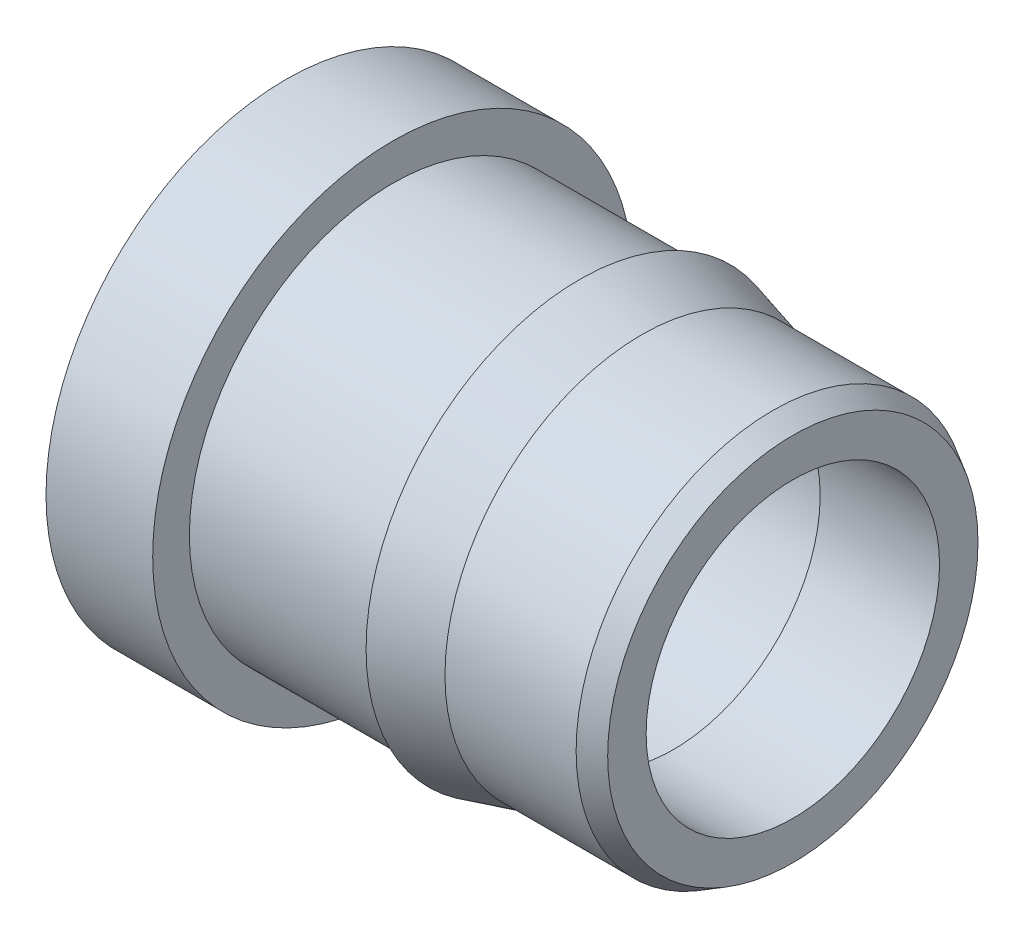
ISO-10303-21;
HEADER;
FILE_DESCRIPTION(('STEP AP214'),'2;1');
FILE_NAME('part.step','',(''),(''),'','','');
FILE_SCHEMA(('AUTOMOTIVE_DESIGN { 1 0 10303 214 1 1 1 1 }'));
ENDSEC;
DATA;
#1=APPLICATION_CONTEXT('core data for automotive mechanical design processes');
#2=APPLICATION_PROTOCOL_DEFINITION('international standard','automotive_design',2000,#1);
#3=PRODUCT_CONTEXT('',#1,'mechanical');
#4=PRODUCT('Part','Part','',(#3));
#5=PRODUCT_RELATED_PRODUCT_CATEGORY('part','',(#4));
#6=PRODUCT_DEFINITION_FORMATION('','',#4);
#7=PRODUCT_DEFINITION_CONTEXT('part definition',#1,'design');
#8=PRODUCT_DEFINITION('design','',#6,#7);
#9=PRODUCT_DEFINITION_SHAPE('','',#8);
#10=(LENGTH_UNIT() NAMED_UNIT(*) SI_UNIT(.MILLI.,.METRE.));
#11=(NAMED_UNIT(*) PLANE_ANGLE_UNIT() SI_UNIT($,.RADIAN.));
#12=(NAMED_UNIT(*) SI_UNIT($,.STERADIAN.) SOLID_ANGLE_UNIT());
#13=UNCERTAINTY_MEASURE_WITH_UNIT(LENGTH_MEASURE(1.E-05),#10,'distance_accuracy_value','');
#14=(GEOMETRIC_REPRESENTATION_CONTEXT(3) GLOBAL_UNCERTAINTY_ASSIGNED_CONTEXT((#13)) GLOBAL_UNIT_ASSIGNED_CONTEXT((#10,
#11,#12)) REPRESENTATION_CONTEXT('',''));
#15=CARTESIAN_POINT('',(0.,0.,0.));
#16=DIRECTION('',(0.,0.,1.));
#17=DIRECTION('',(1.,0.,0.));
#18=AXIS2_PLACEMENT_3D('',#15,#16,#17);
#19=CARTESIAN_POINT('',(1.9304,0.705305909487722,0.));
#20=DIRECTION('',(-1.,0.,0.));
#21=DIRECTION('',(0.,0.,1.));
#22=AXIS2_PLACEMENT_3D('',#19,#20,#21);
#23=PLANE('',#22);
#24=CARTESIAN_POINT('',(1.9304,0.,0.));
#25=DIRECTION('',(1.,0.,0.));
#26=DIRECTION('',(0.,0.,-1.));
#27=AXIS2_PLACEMENT_3D('',#24,#25,#26);
#28=CIRCLE('',#27,0.5588);
#29=CARTESIAN_POINT('',(1.9304,0.,-0.5588));
#30=VERTEX_POINT('',#29);
#31=EDGE_CURVE('E68',#30,#30,#28,.T.);
#32=ORIENTED_EDGE('',*,*,#31,.F.);
#33=EDGE_LOOP('',(#32));
#34=FACE_BOUND('',#33,.T.);
#35=CARTESIAN_POINT('',(1.9304,0.,0.));
#36=DIRECTION('',(-1.,0.,0.));
#37=DIRECTION('',(0.,0.,1.));
#38=AXIS2_PLACEMENT_3D('',#35,#36,#37);
#39=CIRCLE('',#38,0.705305909487722);
#40=CARTESIAN_POINT('',(1.9304,0.,0.705305909487722));
#41=VERTEX_POINT('',#40);
#42=EDGE_CURVE('E10',#41,#41,#39,.T.);
#43=ORIENTED_EDGE('',*,*,#42,.F.);
#44=EDGE_LOOP('',(#43));
#45=FACE_BOUND('',#44,.T.);
#46=ADVANCED_FACE('F31',(#34,#45),#23,.F.);
#47=CARTESIAN_POINT('',(1.9304,0.,0.));
#48=DIRECTION('',(-1.,0.,0.));
#49=DIRECTION('',(0.,0.,1.));
#50=AXIS2_PLACEMENT_3D('',#47,#48,#49);
#51=CONICAL_SURFACE('',#50,0.705305909487722,0.523598775598397);
#52=CARTESIAN_POINT('',(1.8542,0.,0.));
#53=DIRECTION('',(-1.,0.,0.));
#54=DIRECTION('',(0.,0.,1.));
#55=AXIS2_PLACEMENT_3D('',#52,#53,#54);
#56=CIRCLE('',#55,0.749299999999981);
#57=CARTESIAN_POINT('',(1.8542,0.,0.749299999999981));
#58=VERTEX_POINT('',#57);
#59=EDGE_CURVE('E38',#58,#58,#56,.T.);
#60=ORIENTED_EDGE('',*,*,#59,.F.);
#61=EDGE_LOOP('',(#60));
#62=FACE_BOUND('',#61,.T.);
#63=ORIENTED_EDGE('',*,*,#42,.T.);
#64=EDGE_LOOP('',(#63));
#65=FACE_BOUND('',#64,.T.);
#66=ADVANCED_FACE('F87',(#62,#65),#51,.T.);
#67=CARTESIAN_POINT('',(0.,0.,0.));
#68=DIRECTION('',(-1.,0.,0.));
#69=DIRECTION('',(0.,0.,1.));
#70=AXIS2_PLACEMENT_3D('',#67,#68,#69);
#71=CYLINDRICAL_SURFACE('',#70,0.749299999999981);
#72=CARTESIAN_POINT('',(1.35458522628059,0.,0.));
#73=DIRECTION('',(-1.,0.,0.));
#74=DIRECTION('',(0.,0.,1.));
#75=AXIS2_PLACEMENT_3D('',#72,#73,#74);
#76=CIRCLE('',#75,0.749299999999981);
#77=CARTESIAN_POINT('',(1.35458522628059,0.,0.749299999999981));
#78=VERTEX_POINT('',#77);
#79=EDGE_CURVE('E42',#78,#78,#76,.T.);
#80=ORIENTED_EDGE('',*,*,#79,.F.);
#81=EDGE_LOOP('',(#80));
#82=FACE_BOUND('',#81,.T.);
#83=ORIENTED_EDGE('',*,*,#59,.T.);
#84=EDGE_LOOP('',(#83));
#85=FACE_BOUND('',#84,.T.);
#86=ADVANCED_FACE('F92',(#82,#85),#71,.T.);
#87=CARTESIAN_POINT('',(1.35458522628059,0.,0.));
#88=DIRECTION('',(-1.,0.,0.));
#89=DIRECTION('',(0.,0.,1.));
#90=AXIS2_PLACEMENT_3D('',#87,#88,#89);
#91=CONICAL_SURFACE('',#90,0.749299999999981,0.261799387799376);
#92=CARTESIAN_POINT('',(1.1176,0.,0.));
#93=DIRECTION('',(-1.,0.,0.));
#94=DIRECTION('',(0.,0.,1.));
#95=AXIS2_PLACEMENT_3D('',#92,#93,#94);
#96=CIRCLE('',#95,0.81280000000003);
#97=CARTESIAN_POINT('',(1.1176,0.,0.81280000000003));
#98=VERTEX_POINT('',#97);
#99=EDGE_CURVE('E47',#98,#98,#96,.T.);
#100=ORIENTED_EDGE('',*,*,#99,.F.);
#101=EDGE_LOOP('',(#100));
#102=FACE_BOUND('',#101,.T.);
#103=ORIENTED_EDGE('',*,*,#79,.T.);
#104=EDGE_LOOP('',(#103));
#105=FACE_BOUND('',#104,.T.);
#106=ADVANCED_FACE('F98',(#102,#105),#91,.T.);
#107=CARTESIAN_POINT('',(1.1176,0.774699999999989,0.));
#108=DIRECTION('',(1.,0.,0.));
#109=DIRECTION('',(0.,0.,-1.));
#110=AXIS2_PLACEMENT_3D('',#107,#108,#109);
#111=PLANE('',#110);
#112=CARTESIAN_POINT('',(1.1176,0.,0.));
#113=DIRECTION('',(-1.,0.,0.));
#114=DIRECTION('',(0.,0.,1.));
#115=AXIS2_PLACEMENT_3D('',#112,#113,#114);
#116=CIRCLE('',#115,0.774699999999989);
#117=CARTESIAN_POINT('',(1.1176,0.,0.774699999999989));
#118=VERTEX_POINT('',#117);
#119=EDGE_CURVE('E50',#118,#118,#116,.T.);
#120=ORIENTED_EDGE('',*,*,#119,.F.);
#121=EDGE_LOOP('',(#120));
#122=FACE_BOUND('',#121,.T.);
#123=ORIENTED_EDGE('',*,*,#99,.T.);
#124=EDGE_LOOP('',(#123));
#125=FACE_BOUND('',#124,.T.);
#126=ADVANCED_FACE('F105',(#122,#125),#111,.F.);
#127=CARTESIAN_POINT('',(0.,0.,0.));
#128=DIRECTION('',(-1.,0.,0.));
#129=DIRECTION('',(0.,0.,1.));
#130=AXIS2_PLACEMENT_3D('',#127,#128,#129);
#131=CYLINDRICAL_SURFACE('',#130,0.774699999999989);
#132=CARTESIAN_POINT('',(0.406400000000001,0.,0.));
#133=DIRECTION('',(-1.,0.,0.));
#134=DIRECTION('',(0.,0.,1.));
#135=AXIS2_PLACEMENT_3D('',#132,#133,#134);
#136=CIRCLE('',#135,0.774699999999989);
#137=CARTESIAN_POINT('',(0.406400000000001,0.,0.774699999999989));
#138=VERTEX_POINT('',#137);
#139=EDGE_CURVE('E53',#138,#138,#136,.T.);
#140=ORIENTED_EDGE('',*,*,#139,.F.);
#141=EDGE_LOOP('',(#140));
#142=FACE_BOUND('',#141,.T.);
#143=ORIENTED_EDGE('',*,*,#119,.T.);
#144=EDGE_LOOP('',(#143));
#145=FACE_BOUND('',#144,.T.);
#146=ADVANCED_FACE('F109',(#142,#145),#131,.T.);
#147=CARTESIAN_POINT('',(0.406400000000001,0.914399999999982,0.));
#148=DIRECTION('',(-1.,0.,0.));
#149=DIRECTION('',(0.,0.,1.));
#150=AXIS2_PLACEMENT_3D('',#147,#148,#149);
#151=PLANE('',#150);
#152=CARTESIAN_POINT('',(0.406400000000001,0.,0.));
#153=DIRECTION('',(-1.,0.,0.));
#154=DIRECTION('',(0.,0.,1.));
#155=AXIS2_PLACEMENT_3D('',#152,#153,#154);
#156=CIRCLE('',#155,0.914399999999982);
#157=CARTESIAN_POINT('',(0.406400000000001,0.,0.914399999999982));
#158=VERTEX_POINT('',#157);
#159=EDGE_CURVE('E56',#158,#158,#156,.T.);
#160=ORIENTED_EDGE('',*,*,#159,.F.);
#161=EDGE_LOOP('',(#160));
#162=FACE_BOUND('',#161,.T.);
#163=ORIENTED_EDGE('',*,*,#139,.T.);
#164=EDGE_LOOP('',(#163));
#165=FACE_BOUND('',#164,.T.);
#166=ADVANCED_FACE('F113',(#162,#165),#151,.F.);
#167=CARTESIAN_POINT('',(0.,0.,0.));
#168=DIRECTION('',(-1.,0.,0.));
#169=DIRECTION('',(0.,0.,1.));
#170=AXIS2_PLACEMENT_3D('',#167,#168,#169);
#171=CYLINDRICAL_SURFACE('',#170,0.914399999999982);
#172=CARTESIAN_POINT('',(0.,0.,0.));
#173=DIRECTION('',(-1.,0.,0.));
#174=DIRECTION('',(0.,0.,1.));
#175=AXIS2_PLACEMENT_3D('',#172,#173,#174);
#176=CIRCLE('',#175,0.914399999999982);
#177=CARTESIAN_POINT('',(0.,0.,0.914399999999982));
#178=VERTEX_POINT('',#177);
#179=EDGE_CURVE('E59',#178,#178,#176,.T.);
#180=ORIENTED_EDGE('',*,*,#179,.F.);
#181=EDGE_LOOP('',(#180));
#182=FACE_BOUND('',#181,.T.);
#183=ORIENTED_EDGE('',*,*,#159,.T.);
#184=EDGE_LOOP('',(#183));
#185=FACE_BOUND('',#184,.T.);
#186=ADVANCED_FACE('F117',(#182,#185),#171,.T.);
#187=CARTESIAN_POINT('',(0.,0.,0.));
#188=DIRECTION('',(1.,0.,0.));
#189=DIRECTION('',(0.,0.,-1.));
#190=AXIS2_PLACEMENT_3D('',#187,#188,#189);
#191=PLANE('',#190);
#192=CARTESIAN_POINT('',(0.,0.,0.));
#193=DIRECTION('',(-1.,0.,0.));
#194=DIRECTION('',(0.,0.,1.));
#195=AXIS2_PLACEMENT_3D('',#192,#193,#194);
#196=CIRCLE('',#195,0.647699999999999);
#197=CARTESIAN_POINT('',(0.,0.,0.647699999999999));
#198=VERTEX_POINT('',#197);
#199=EDGE_CURVE('E62',#198,#198,#196,.T.);
#200=ORIENTED_EDGE('',*,*,#199,.F.);
#201=EDGE_LOOP('',(#200));
#202=FACE_BOUND('',#201,.T.);
#203=ORIENTED_EDGE('',*,*,#179,.T.);
#204=EDGE_LOOP('',(#203));
#205=FACE_BOUND('',#204,.T.);
#206=ADVANCED_FACE('F121',(#202,#205),#191,.F.);
#207=CARTESIAN_POINT('',(0.,0.,0.));
#208=DIRECTION('',(-1.,0.,0.));
#209=DIRECTION('',(0.,0.,1.));
#210=AXIS2_PLACEMENT_3D('',#207,#208,#209);
#211=CYLINDRICAL_SURFACE('',#210,0.647699999999999);
#212=CARTESIAN_POINT('',(1.4224,0.,0.));
#213=DIRECTION('',(-1.,0.,0.));
#214=DIRECTION('',(0.,0.,1.));
#215=AXIS2_PLACEMENT_3D('',#212,#213,#214);
#216=CIRCLE('',#215,0.6477);
#217=CARTESIAN_POINT('',(1.4224,0.,0.6477));
#218=VERTEX_POINT('',#217);
#219=EDGE_CURVE('E65',#218,#218,#216,.T.);
#220=ORIENTED_EDGE('',*,*,#219,.F.);
#221=EDGE_LOOP('',(#220));
#222=FACE_BOUND('',#221,.T.);
#223=ORIENTED_EDGE('',*,*,#199,.T.);
#224=EDGE_LOOP('',(#223));
#225=FACE_BOUND('',#224,.T.);
#226=ADVANCED_FACE('F84',(#222,#225),#211,.F.);
#227=CARTESIAN_POINT('',(1.4224,0.,0.));
#228=DIRECTION('',(-1.,0.,0.));
#229=DIRECTION('',(0.,0.,1.));
#230=AXIS2_PLACEMENT_3D('',#227,#228,#229);
#231=CONICAL_SURFACE('',#230,0.6477,1.02974425867666);
#232=CARTESIAN_POINT('',(1.47581650903155,0.,0.));
#233=DIRECTION('',(-1.,0.,0.));
#234=DIRECTION('',(0.,0.,1.));
#235=AXIS2_PLACEMENT_3D('',#232,#233,#234);
#236=CIRCLE('',#235,0.5588);
#237=CARTESIAN_POINT('',(1.47581650903155,0.,0.5588));
#238=VERTEX_POINT('',#237);
#239=EDGE_CURVE('E34',#238,#238,#236,.F.);
#240=ORIENTED_EDGE('',*,*,#239,.T.);
#241=EDGE_LOOP('',(#240));
#242=FACE_BOUND('',#241,.T.);
#243=ORIENTED_EDGE('',*,*,#219,.T.);
#244=EDGE_LOOP('',(#243));
#245=FACE_BOUND('',#244,.T.);
#246=ADVANCED_FACE('F75',(#242,#245),#231,.F.);
#247=CARTESIAN_POINT('',(1.9304,0.,0.));
#248=DIRECTION('',(1.,0.,0.));
#249=DIRECTION('',(0.,0.,-1.));
#250=AXIS2_PLACEMENT_3D('',#247,#248,#249);
#251=CYLINDRICAL_SURFACE('',#250,0.5588);
#252=ORIENTED_EDGE('',*,*,#31,.T.);
#253=EDGE_LOOP('',(#252));
#254=FACE_BOUND('',#253,.T.);
#255=ORIENTED_EDGE('',*,*,#239,.F.);
#256=EDGE_LOOP('',(#255));
#257=FACE_BOUND('',#256,.T.);
#258=ADVANCED_FACE('F78',(#254,#257),#251,.F.);
#259=CLOSED_SHELL('',(#46,#66,#86,#106,#126,#146,#166,#186,#206,#226,#246,#258));
#260=MANIFOLD_SOLID_BREP('B2',#259);
#261=ADVANCED_BREP_SHAPE_REPRESENTATION('',(#18,#260),#14);
#262=SHAPE_DEFINITION_REPRESENTATION(#9,#261);
ENDSEC;
END-ISO-10303-21;
